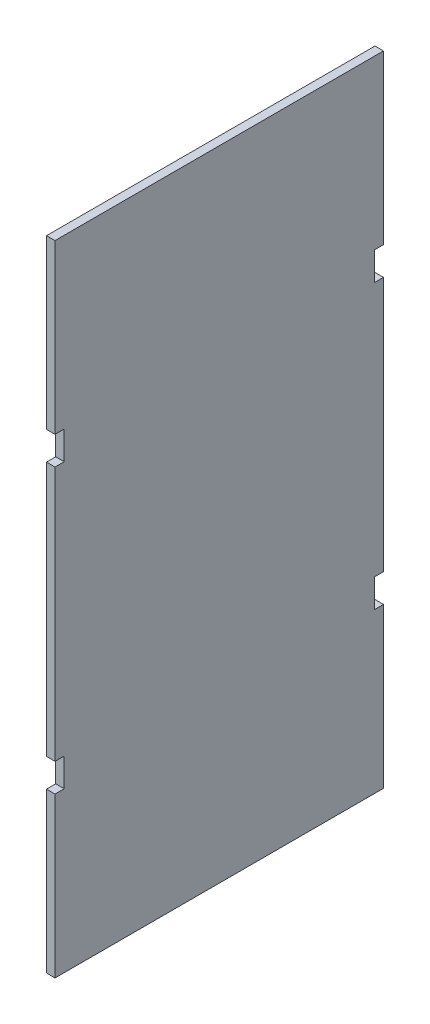
ISO-10303-21;
HEADER;
FILE_DESCRIPTION(('STEP AP214'),'2;1');
FILE_NAME('part.step','',(''),(''),'','','');
FILE_SCHEMA(('AUTOMOTIVE_DESIGN { 1 0 10303 214 1 1 1 1 }'));
ENDSEC;
DATA;
#1=APPLICATION_CONTEXT('core data for automotive mechanical design processes');
#2=APPLICATION_PROTOCOL_DEFINITION('international standard','automotive_design',2000,#1);
#3=PRODUCT_CONTEXT('',#1,'mechanical');
#4=PRODUCT('Part','Part','',(#3));
#5=PRODUCT_RELATED_PRODUCT_CATEGORY('part','',(#4));
#6=PRODUCT_DEFINITION_FORMATION('','',#4);
#7=PRODUCT_DEFINITION_CONTEXT('part definition',#1,'design');
#8=PRODUCT_DEFINITION('design','',#6,#7);
#9=PRODUCT_DEFINITION_SHAPE('','',#8);
#10=(LENGTH_UNIT() NAMED_UNIT(*) SI_UNIT(.MILLI.,.METRE.));
#11=(NAMED_UNIT(*) PLANE_ANGLE_UNIT() SI_UNIT($,.RADIAN.));
#12=(NAMED_UNIT(*) SI_UNIT($,.STERADIAN.) SOLID_ANGLE_UNIT());
#13=UNCERTAINTY_MEASURE_WITH_UNIT(LENGTH_MEASURE(1.E-05),#10,'distance_accuracy_value','');
#14=(GEOMETRIC_REPRESENTATION_CONTEXT(3) GLOBAL_UNCERTAINTY_ASSIGNED_CONTEXT((#13)) GLOBAL_UNIT_ASSIGNED_CONTEXT((#10,
#11,#12)) REPRESENTATION_CONTEXT('',''));
#15=CARTESIAN_POINT('',(0.,0.,0.));
#16=DIRECTION('',(0.,0.,1.));
#17=DIRECTION('',(1.,0.,0.));
#18=AXIS2_PLACEMENT_3D('',#15,#16,#17);
#19=CARTESIAN_POINT('',(6.,112.5,2.0417695312247E-12));
#20=DIRECTION('',(0.,0.,-1.));
#21=DIRECTION('',(0.,1.,0.));
#22=AXIS2_PLACEMENT_3D('',#19,#20,#21);
#23=PLANE('',#22);
#24=DIRECTION('',(0.,-1.,0.));
#25=VECTOR('',#24,1.);
#26=CARTESIAN_POINT('',(0.,112.5,2.0417695312247E-12));
#27=LINE('',#26,#25);
#28=CARTESIAN_POINT('',(0.,112.5,2.0417695312247E-12));
#29=VERTEX_POINT('',#28);
#30=CARTESIAN_POINT('',(0.,0.,0.));
#31=VERTEX_POINT('',#30);
#32=EDGE_CURVE('E218',#29,#31,#27,.T.);
#33=ORIENTED_EDGE('',*,*,#32,.T.);
#34=DIRECTION('',(-1.,0.,0.));
#35=VECTOR('',#34,1.);
#36=CARTESIAN_POINT('',(6.,0.,0.));
#37=LINE('',#36,#35);
#38=CARTESIAN_POINT('',(6.,0.,0.));
#39=VERTEX_POINT('',#38);
#40=EDGE_CURVE('E11',#39,#31,#37,.T.);
#41=ORIENTED_EDGE('',*,*,#40,.F.);
#42=DIRECTION('',(0.,-1.,0.));
#43=VECTOR('',#42,1.);
#44=CARTESIAN_POINT('',(6.,112.5,2.0417695312247E-12));
#45=LINE('',#44,#43);
#46=CARTESIAN_POINT('',(6.,112.5,2.0417695312247E-12));
#47=VERTEX_POINT('',#46);
#48=EDGE_CURVE('E276',#47,#39,#45,.T.);
#49=ORIENTED_EDGE('',*,*,#48,.F.);
#50=DIRECTION('',(-1.,0.,0.));
#51=VECTOR('',#50,1.);
#52=CARTESIAN_POINT('',(6.,112.5,2.0417695312247E-12));
#53=LINE('',#52,#51);
#54=EDGE_CURVE('E214',#47,#29,#53,.T.);
#55=ORIENTED_EDGE('',*,*,#54,.T.);
#56=EDGE_LOOP('',(#33,#41,#49,#55));
#57=FACE_BOUND('',#56,.T.);
#58=ADVANCED_FACE('F45',(#57),#23,.F.);
#59=CARTESIAN_POINT('',(6.,0.,0.));
#60=DIRECTION('',(0.,1.,0.));
#61=DIRECTION('',(0.,0.,1.));
#62=AXIS2_PLACEMENT_3D('',#59,#60,#61);
#63=PLANE('',#62);
#64=DIRECTION('',(0.,0.,-1.));
#65=VECTOR('',#64,1.);
#66=CARTESIAN_POINT('',(0.,0.,0.));
#67=LINE('',#66,#65);
#68=CARTESIAN_POINT('',(0.,0.,-232.));
#69=VERTEX_POINT('',#68);
#70=EDGE_CURVE('E222',#31,#69,#67,.T.);
#71=ORIENTED_EDGE('',*,*,#70,.T.);
#72=DIRECTION('',(-1.,0.,0.));
#73=VECTOR('',#72,1.);
#74=CARTESIAN_POINT('',(6.,0.,-232.));
#75=LINE('',#74,#73);
#76=CARTESIAN_POINT('',(6.,0.,-232.));
#77=VERTEX_POINT('',#76);
#78=EDGE_CURVE('E54',#77,#69,#75,.T.);
#79=ORIENTED_EDGE('',*,*,#78,.F.);
#80=DIRECTION('',(0.,0.,-1.));
#81=VECTOR('',#80,1.);
#82=CARTESIAN_POINT('',(6.,0.,0.));
#83=LINE('',#82,#81);
#84=EDGE_CURVE('E141',#39,#77,#83,.T.);
#85=ORIENTED_EDGE('',*,*,#84,.F.);
#86=ORIENTED_EDGE('',*,*,#40,.T.);
#87=EDGE_LOOP('',(#71,#79,#85,#86));
#88=FACE_BOUND('',#87,.T.);
#89=ADVANCED_FACE('F426',(#88),#63,.F.);
#90=CARTESIAN_POINT('',(6.,0.,-232.));
#91=DIRECTION('',(0.,0.,1.));
#92=DIRECTION('',(1.,0.,0.));
#93=AXIS2_PLACEMENT_3D('',#90,#91,#92);
#94=PLANE('',#93);
#95=DIRECTION('',(0.,1.,0.));
#96=VECTOR('',#95,1.);
#97=CARTESIAN_POINT('',(0.,0.,-232.));
#98=LINE('',#97,#96);
#99=CARTESIAN_POINT('',(0.,112.5,-232.));
#100=VERTEX_POINT('',#99);
#101=EDGE_CURVE('E225',#69,#100,#98,.T.);
#102=ORIENTED_EDGE('',*,*,#101,.T.);
#103=DIRECTION('',(-1.,0.,0.));
#104=VECTOR('',#103,1.);
#105=CARTESIAN_POINT('',(6.,112.5,-232.));
#106=LINE('',#105,#104);
#107=CARTESIAN_POINT('',(6.,112.5,-232.));
#108=VERTEX_POINT('',#107);
#109=EDGE_CURVE('E335',#108,#100,#106,.T.);
#110=ORIENTED_EDGE('',*,*,#109,.F.);
#111=DIRECTION('',(0.,1.,0.));
#112=VECTOR('',#111,1.);
#113=CARTESIAN_POINT('',(6.,0.,-232.));
#114=LINE('',#113,#112);
#115=EDGE_CURVE('E345',#77,#108,#114,.T.);
#116=ORIENTED_EDGE('',*,*,#115,.F.);
#117=ORIENTED_EDGE('',*,*,#78,.T.);
#118=EDGE_LOOP('',(#102,#110,#116,#117));
#119=FACE_BOUND('',#118,.T.);
#120=ADVANCED_FACE('F343',(#119),#94,.F.);
#121=CARTESIAN_POINT('',(6.,112.5,-225.5));
#122=DIRECTION('',(0.,-1.,0.));
#123=DIRECTION('',(0.,0.,-1.));
#124=AXIS2_PLACEMENT_3D('',#121,#122,#123);
#125=PLANE('',#124);
#126=DIRECTION('',(0.,0.,1.));
#127=VECTOR('',#126,1.);
#128=CARTESIAN_POINT('',(0.,112.5,-225.5));
#129=LINE('',#128,#127);
#130=CARTESIAN_POINT('',(0.,112.5,-225.5));
#131=VERTEX_POINT('',#130);
#132=EDGE_CURVE('E228',#100,#131,#129,.T.);
#133=ORIENTED_EDGE('',*,*,#132,.T.);
#134=DIRECTION('',(-1.,0.,0.));
#135=VECTOR('',#134,1.);
#136=CARTESIAN_POINT('',(6.,112.5,-225.5));
#137=LINE('',#136,#135);
#138=CARTESIAN_POINT('',(6.,112.5,-225.5));
#139=VERTEX_POINT('',#138);
#140=EDGE_CURVE('E331',#139,#131,#137,.T.);
#141=ORIENTED_EDGE('',*,*,#140,.F.);
#142=DIRECTION('',(0.,0.,1.));
#143=VECTOR('',#142,1.);
#144=CARTESIAN_POINT('',(6.,112.5,-225.5));
#145=LINE('',#144,#143);
#146=EDGE_CURVE('E364',#108,#139,#145,.T.);
#147=ORIENTED_EDGE('',*,*,#146,.F.);
#148=ORIENTED_EDGE('',*,*,#109,.T.);
#149=EDGE_LOOP('',(#133,#141,#147,#148));
#150=FACE_BOUND('',#149,.T.);
#151=ADVANCED_FACE('F354',(#150),#125,.F.);
#152=CARTESIAN_POINT('',(6.,132.5,-225.5));
#153=DIRECTION('',(0.,0.,1.));
#154=DIRECTION('',(1.,0.,0.));
#155=AXIS2_PLACEMENT_3D('',#152,#153,#154);
#156=PLANE('',#155);
#157=DIRECTION('',(0.,1.,0.));
#158=VECTOR('',#157,1.);
#159=CARTESIAN_POINT('',(0.,132.5,-225.5));
#160=LINE('',#159,#158);
#161=CARTESIAN_POINT('',(0.,132.5,-225.5));
#162=VERTEX_POINT('',#161);
#163=EDGE_CURVE('E231',#131,#162,#160,.T.);
#164=ORIENTED_EDGE('',*,*,#163,.T.);
#165=DIRECTION('',(-1.,0.,0.));
#166=VECTOR('',#165,1.);
#167=CARTESIAN_POINT('',(6.,132.5,-225.5));
#168=LINE('',#167,#166);
#169=CARTESIAN_POINT('',(6.,132.5,-225.5));
#170=VERTEX_POINT('',#169);
#171=EDGE_CURVE('E327',#170,#162,#168,.T.);
#172=ORIENTED_EDGE('',*,*,#171,.F.);
#173=DIRECTION('',(0.,1.,0.));
#174=VECTOR('',#173,1.);
#175=CARTESIAN_POINT('',(6.,132.5,-225.5));
#176=LINE('',#175,#174);
#177=EDGE_CURVE('E360',#139,#170,#176,.T.);
#178=ORIENTED_EDGE('',*,*,#177,.F.);
#179=ORIENTED_EDGE('',*,*,#140,.T.);
#180=EDGE_LOOP('',(#164,#172,#178,#179));
#181=FACE_BOUND('',#180,.T.);
#182=ADVANCED_FACE('F358',(#181),#156,.F.);
#183=CARTESIAN_POINT('',(6.,132.5,-232.));
#184=DIRECTION('',(0.,1.,0.));
#185=DIRECTION('',(0.,0.,1.));
#186=AXIS2_PLACEMENT_3D('',#183,#184,#185);
#187=PLANE('',#186);
#188=DIRECTION('',(0.,0.,-1.));
#189=VECTOR('',#188,1.);
#190=CARTESIAN_POINT('',(0.,132.5,-232.));
#191=LINE('',#190,#189);
#192=CARTESIAN_POINT('',(0.,132.5,-232.));
#193=VERTEX_POINT('',#192);
#194=EDGE_CURVE('E234',#162,#193,#191,.T.);
#195=ORIENTED_EDGE('',*,*,#194,.T.);
#196=DIRECTION('',(-1.,0.,0.));
#197=VECTOR('',#196,1.);
#198=CARTESIAN_POINT('',(6.,132.5,-232.));
#199=LINE('',#198,#197);
#200=CARTESIAN_POINT('',(6.,132.5,-232.));
#201=VERTEX_POINT('',#200);
#202=EDGE_CURVE('E323',#201,#193,#199,.T.);
#203=ORIENTED_EDGE('',*,*,#202,.F.);
#204=DIRECTION('',(0.,0.,-1.));
#205=VECTOR('',#204,1.);
#206=CARTESIAN_POINT('',(6.,132.5,-232.));
#207=LINE('',#206,#205);
#208=EDGE_CURVE('E363',#170,#201,#207,.T.);
#209=ORIENTED_EDGE('',*,*,#208,.F.);
#210=ORIENTED_EDGE('',*,*,#171,.T.);
#211=EDGE_LOOP('',(#195,#203,#209,#210));
#212=FACE_BOUND('',#211,.T.);
#213=ADVANCED_FACE('F439',(#212),#187,.F.);
#214=CARTESIAN_POINT('',(6.,132.5,-232.));
#215=DIRECTION('',(0.,0.,1.));
#216=DIRECTION('',(1.,0.,0.));
#217=AXIS2_PLACEMENT_3D('',#214,#215,#216);
#218=PLANE('',#217);
#219=DIRECTION('',(0.,1.,0.));
#220=VECTOR('',#219,1.);
#221=CARTESIAN_POINT('',(0.,132.5,-232.));
#222=LINE('',#221,#220);
#223=CARTESIAN_POINT('',(0.,312.5,-232.));
#224=VERTEX_POINT('',#223);
#225=EDGE_CURVE('E237',#193,#224,#222,.T.);
#226=ORIENTED_EDGE('',*,*,#225,.T.);
#227=DIRECTION('',(-1.,0.,0.));
#228=VECTOR('',#227,1.);
#229=CARTESIAN_POINT('',(6.,312.5,-232.));
#230=LINE('',#229,#228);
#231=CARTESIAN_POINT('',(6.,312.5,-232.));
#232=VERTEX_POINT('',#231);
#233=EDGE_CURVE('E319',#232,#224,#230,.T.);
#234=ORIENTED_EDGE('',*,*,#233,.F.);
#235=DIRECTION('',(0.,1.,0.));
#236=VECTOR('',#235,1.);
#237=CARTESIAN_POINT('',(6.,132.5,-232.));
#238=LINE('',#237,#236);
#239=EDGE_CURVE('E368',#201,#232,#238,.T.);
#240=ORIENTED_EDGE('',*,*,#239,.F.);
#241=ORIENTED_EDGE('',*,*,#202,.T.);
#242=EDGE_LOOP('',(#226,#234,#240,#241));
#243=FACE_BOUND('',#242,.T.);
#244=ADVANCED_FACE('F442',(#243),#218,.F.);
#245=CARTESIAN_POINT('',(6.,312.5,-225.5));
#246=DIRECTION('',(0.,-1.,0.));
#247=DIRECTION('',(0.,0.,-1.));
#248=AXIS2_PLACEMENT_3D('',#245,#246,#247);
#249=PLANE('',#248);
#250=DIRECTION('',(0.,0.,1.));
#251=VECTOR('',#250,1.);
#252=CARTESIAN_POINT('',(0.,312.5,-225.5));
#253=LINE('',#252,#251);
#254=CARTESIAN_POINT('',(0.,312.5,-225.5));
#255=VERTEX_POINT('',#254);
#256=EDGE_CURVE('E240',#224,#255,#253,.T.);
#257=ORIENTED_EDGE('',*,*,#256,.T.);
#258=DIRECTION('',(-1.,0.,0.));
#259=VECTOR('',#258,1.);
#260=CARTESIAN_POINT('',(6.,312.5,-225.5));
#261=LINE('',#260,#259);
#262=CARTESIAN_POINT('',(6.,312.5,-225.5));
#263=VERTEX_POINT('',#262);
#264=EDGE_CURVE('E315',#263,#255,#261,.T.);
#265=ORIENTED_EDGE('',*,*,#264,.F.);
#266=DIRECTION('',(0.,0.,1.));
#267=VECTOR('',#266,1.);
#268=CARTESIAN_POINT('',(6.,312.5,-225.5));
#269=LINE('',#268,#267);
#270=EDGE_CURVE('E375',#232,#263,#269,.T.);
#271=ORIENTED_EDGE('',*,*,#270,.F.);
#272=ORIENTED_EDGE('',*,*,#233,.T.);
#273=EDGE_LOOP('',(#257,#265,#271,#272));
#274=FACE_BOUND('',#273,.T.);
#275=ADVANCED_FACE('F446',(#274),#249,.F.);
#276=CARTESIAN_POINT('',(6.,332.5,-225.5));
#277=DIRECTION('',(0.,0.,1.));
#278=DIRECTION('',(1.,0.,0.));
#279=AXIS2_PLACEMENT_3D('',#276,#277,#278);
#280=PLANE('',#279);
#281=DIRECTION('',(0.,1.,0.));
#282=VECTOR('',#281,1.);
#283=CARTESIAN_POINT('',(0.,332.5,-225.5));
#284=LINE('',#283,#282);
#285=CARTESIAN_POINT('',(0.,332.5,-225.5));
#286=VERTEX_POINT('',#285);
#287=EDGE_CURVE('E243',#255,#286,#284,.T.);
#288=ORIENTED_EDGE('',*,*,#287,.T.);
#289=DIRECTION('',(-1.,0.,0.));
#290=VECTOR('',#289,1.);
#291=CARTESIAN_POINT('',(6.,332.5,-225.5));
#292=LINE('',#291,#290);
#293=CARTESIAN_POINT('',(6.,332.5,-225.5));
#294=VERTEX_POINT('',#293);
#295=EDGE_CURVE('E311',#294,#286,#292,.T.);
#296=ORIENTED_EDGE('',*,*,#295,.F.);
#297=DIRECTION('',(0.,1.,0.));
#298=VECTOR('',#297,1.);
#299=CARTESIAN_POINT('',(6.,332.5,-225.5));
#300=LINE('',#299,#298);
#301=EDGE_CURVE('E378',#263,#294,#300,.T.);
#302=ORIENTED_EDGE('',*,*,#301,.F.);
#303=ORIENTED_EDGE('',*,*,#264,.T.);
#304=EDGE_LOOP('',(#288,#296,#302,#303));
#305=FACE_BOUND('',#304,.T.);
#306=ADVANCED_FACE('F450',(#305),#280,.F.);
#307=CARTESIAN_POINT('',(6.,332.5,-232.));
#308=DIRECTION('',(0.,1.,0.));
#309=DIRECTION('',(0.,0.,1.));
#310=AXIS2_PLACEMENT_3D('',#307,#308,#309);
#311=PLANE('',#310);
#312=DIRECTION('',(0.,0.,-1.));
#313=VECTOR('',#312,1.);
#314=CARTESIAN_POINT('',(0.,332.5,-232.));
#315=LINE('',#314,#313);
#316=CARTESIAN_POINT('',(0.,332.5,-232.));
#317=VERTEX_POINT('',#316);
#318=EDGE_CURVE('E246',#286,#317,#315,.T.);
#319=ORIENTED_EDGE('',*,*,#318,.T.);
#320=DIRECTION('',(-1.,0.,0.));
#321=VECTOR('',#320,1.);
#322=CARTESIAN_POINT('',(6.,332.5,-232.));
#323=LINE('',#322,#321);
#324=CARTESIAN_POINT('',(6.,332.5,-232.));
#325=VERTEX_POINT('',#324);
#326=EDGE_CURVE('E307',#325,#317,#323,.T.);
#327=ORIENTED_EDGE('',*,*,#326,.F.);
#328=DIRECTION('',(0.,0.,-1.));
#329=VECTOR('',#328,1.);
#330=CARTESIAN_POINT('',(6.,332.5,-232.));
#331=LINE('',#330,#329);
#332=EDGE_CURVE('E381',#294,#325,#331,.T.);
#333=ORIENTED_EDGE('',*,*,#332,.F.);
#334=ORIENTED_EDGE('',*,*,#295,.T.);
#335=EDGE_LOOP('',(#319,#327,#333,#334));
#336=FACE_BOUND('',#335,.T.);
#337=ADVANCED_FACE('F454',(#336),#311,.F.);
#338=CARTESIAN_POINT('',(6.,332.5,-232.));
#339=DIRECTION('',(0.,0.,1.));
#340=DIRECTION('',(1.,0.,0.));
#341=AXIS2_PLACEMENT_3D('',#338,#339,#340);
#342=PLANE('',#341);
#343=DIRECTION('',(0.,1.,0.));
#344=VECTOR('',#343,1.);
#345=CARTESIAN_POINT('',(0.,332.5,-232.));
#346=LINE('',#345,#344);
#347=CARTESIAN_POINT('',(0.,451.,-232.));
#348=VERTEX_POINT('',#347);
#349=EDGE_CURVE('E249',#317,#348,#346,.T.);
#350=ORIENTED_EDGE('',*,*,#349,.T.);
#351=DIRECTION('',(-1.,0.,0.));
#352=VECTOR('',#351,1.);
#353=CARTESIAN_POINT('',(6.,451.,-232.));
#354=LINE('',#353,#352);
#355=CARTESIAN_POINT('',(6.,451.,-232.));
#356=VERTEX_POINT('',#355);
#357=EDGE_CURVE('E303',#356,#348,#354,.T.);
#358=ORIENTED_EDGE('',*,*,#357,.F.);
#359=DIRECTION('',(0.,1.,0.));
#360=VECTOR('',#359,1.);
#361=CARTESIAN_POINT('',(6.,332.5,-232.));
#362=LINE('',#361,#360);
#363=EDGE_CURVE('E384',#325,#356,#362,.T.);
#364=ORIENTED_EDGE('',*,*,#363,.F.);
#365=ORIENTED_EDGE('',*,*,#326,.T.);
#366=EDGE_LOOP('',(#350,#358,#364,#365));
#367=FACE_BOUND('',#366,.T.);
#368=ADVANCED_FACE('F458',(#367),#342,.F.);
#369=CARTESIAN_POINT('',(6.,451.,-232.));
#370=DIRECTION('',(0.,-1.,0.));
#371=DIRECTION('',(0.,0.,-1.));
#372=AXIS2_PLACEMENT_3D('',#369,#370,#371);
#373=PLANE('',#372);
#374=DIRECTION('',(0.,0.,1.));
#375=VECTOR('',#374,1.);
#376=CARTESIAN_POINT('',(0.,451.,-232.));
#377=LINE('',#376,#375);
#378=CARTESIAN_POINT('',(0.,451.,0.));
#379=VERTEX_POINT('',#378);
#380=EDGE_CURVE('E252',#348,#379,#377,.T.);
#381=ORIENTED_EDGE('',*,*,#380,.T.);
#382=DIRECTION('',(-1.,0.,0.));
#383=VECTOR('',#382,1.);
#384=CARTESIAN_POINT('',(6.,451.,0.));
#385=LINE('',#384,#383);
#386=CARTESIAN_POINT('',(6.,451.,0.));
#387=VERTEX_POINT('',#386);
#388=EDGE_CURVE('E299',#387,#379,#385,.T.);
#389=ORIENTED_EDGE('',*,*,#388,.F.);
#390=DIRECTION('',(0.,0.,1.));
#391=VECTOR('',#390,1.);
#392=CARTESIAN_POINT('',(6.,451.,-232.));
#393=LINE('',#392,#391);
#394=EDGE_CURVE('E387',#356,#387,#393,.T.);
#395=ORIENTED_EDGE('',*,*,#394,.F.);
#396=ORIENTED_EDGE('',*,*,#357,.T.);
#397=EDGE_LOOP('',(#381,#389,#395,#396));
#398=FACE_BOUND('',#397,.T.);
#399=ADVANCED_FACE('F462',(#398),#373,.F.);
#400=CARTESIAN_POINT('',(6.,451.,0.));
#401=DIRECTION('',(0.,0.,-1.));
#402=DIRECTION('',(0.,1.,0.));
#403=AXIS2_PLACEMENT_3D('',#400,#401,#402);
#404=PLANE('',#403);
#405=DIRECTION('',(0.,-1.,0.));
#406=VECTOR('',#405,1.);
#407=CARTESIAN_POINT('',(0.,451.,0.));
#408=LINE('',#407,#406);
#409=CARTESIAN_POINT('',(0.,332.5,2.06779038336435E-12));
#410=VERTEX_POINT('',#409);
#411=EDGE_CURVE('E255',#379,#410,#408,.T.);
#412=ORIENTED_EDGE('',*,*,#411,.T.);
#413=DIRECTION('',(-1.,0.,0.));
#414=VECTOR('',#413,1.);
#415=CARTESIAN_POINT('',(6.,332.5,2.06779038336435E-12));
#416=LINE('',#415,#414);
#417=CARTESIAN_POINT('',(6.,332.5,2.06779038336435E-12));
#418=VERTEX_POINT('',#417);
#419=EDGE_CURVE('E295',#418,#410,#416,.T.);
#420=ORIENTED_EDGE('',*,*,#419,.F.);
#421=DIRECTION('',(0.,-1.,0.));
#422=VECTOR('',#421,1.);
#423=CARTESIAN_POINT('',(6.,451.,0.));
#424=LINE('',#423,#422);
#425=EDGE_CURVE('E390',#387,#418,#424,.T.);
#426=ORIENTED_EDGE('',*,*,#425,.F.);
#427=ORIENTED_EDGE('',*,*,#388,.T.);
#428=EDGE_LOOP('',(#412,#420,#426,#427));
#429=FACE_BOUND('',#428,.T.);
#430=ADVANCED_FACE('F466',(#429),#404,.F.);
#431=CARTESIAN_POINT('',(6.,332.5,-6.49999999999793));
#432=DIRECTION('',(0.,1.,0.));
#433=DIRECTION('',(0.,0.,1.));
#434=AXIS2_PLACEMENT_3D('',#431,#432,#433);
#435=PLANE('',#434);
#436=DIRECTION('',(0.,0.,-1.));
#437=VECTOR('',#436,1.);
#438=CARTESIAN_POINT('',(0.,332.5,-6.49999999999793));
#439=LINE('',#438,#437);
#440=CARTESIAN_POINT('',(0.,332.5,-6.49999999999793));
#441=VERTEX_POINT('',#440);
#442=EDGE_CURVE('E258',#410,#441,#439,.T.);
#443=ORIENTED_EDGE('',*,*,#442,.T.);
#444=DIRECTION('',(-1.,0.,0.));
#445=VECTOR('',#444,1.);
#446=CARTESIAN_POINT('',(6.,332.5,-6.49999999999793));
#447=LINE('',#446,#445);
#448=CARTESIAN_POINT('',(6.,332.5,-6.49999999999793));
#449=VERTEX_POINT('',#448);
#450=EDGE_CURVE('E291',#449,#441,#447,.T.);
#451=ORIENTED_EDGE('',*,*,#450,.F.);
#452=DIRECTION('',(0.,0.,-1.));
#453=VECTOR('',#452,1.);
#454=CARTESIAN_POINT('',(6.,332.5,-6.49999999999793));
#455=LINE('',#454,#453);
#456=EDGE_CURVE('E393',#418,#449,#455,.T.);
#457=ORIENTED_EDGE('',*,*,#456,.F.);
#458=ORIENTED_EDGE('',*,*,#419,.T.);
#459=EDGE_LOOP('',(#443,#451,#457,#458));
#460=FACE_BOUND('',#459,.T.);
#461=ADVANCED_FACE('F470',(#460),#435,.F.);
#462=CARTESIAN_POINT('',(6.,312.5,-6.49999999999793));
#463=DIRECTION('',(0.,0.,-1.));
#464=DIRECTION('',(-1.,0.,0.));
#465=AXIS2_PLACEMENT_3D('',#462,#463,#464);
#466=PLANE('',#465);
#467=DIRECTION('',(0.,-1.,0.));
#468=VECTOR('',#467,1.);
#469=CARTESIAN_POINT('',(0.,312.5,-6.49999999999793));
#470=LINE('',#469,#468);
#471=CARTESIAN_POINT('',(0.,312.5,-6.49999999999793));
#472=VERTEX_POINT('',#471);
#473=EDGE_CURVE('E261',#441,#472,#470,.T.);
#474=ORIENTED_EDGE('',*,*,#473,.T.);
#475=DIRECTION('',(-1.,0.,0.));
#476=VECTOR('',#475,1.);
#477=CARTESIAN_POINT('',(6.,312.5,-6.49999999999793));
#478=LINE('',#477,#476);
#479=CARTESIAN_POINT('',(6.,312.5,-6.49999999999793));
#480=VERTEX_POINT('',#479);
#481=EDGE_CURVE('E287',#480,#472,#478,.T.);
#482=ORIENTED_EDGE('',*,*,#481,.F.);
#483=DIRECTION('',(0.,-1.,0.));
#484=VECTOR('',#483,1.);
#485=CARTESIAN_POINT('',(6.,312.5,-6.49999999999793));
#486=LINE('',#485,#484);
#487=EDGE_CURVE('E396',#449,#480,#486,.T.);
#488=ORIENTED_EDGE('',*,*,#487,.F.);
#489=ORIENTED_EDGE('',*,*,#450,.T.);
#490=EDGE_LOOP('',(#474,#482,#488,#489));
#491=FACE_BOUND('',#490,.T.);
#492=ADVANCED_FACE('F474',(#491),#466,.F.);
#493=CARTESIAN_POINT('',(6.,312.5,2.07125983031631E-12));
#494=DIRECTION('',(0.,-1.,0.));
#495=DIRECTION('',(0.,0.,-1.));
#496=AXIS2_PLACEMENT_3D('',#493,#494,#495);
#497=PLANE('',#496);
#498=DIRECTION('',(0.,0.,1.));
#499=VECTOR('',#498,1.);
#500=CARTESIAN_POINT('',(0.,312.5,2.07125983031631E-12));
#501=LINE('',#500,#499);
#502=CARTESIAN_POINT('',(0.,312.5,2.07125983031631E-12));
#503=VERTEX_POINT('',#502);
#504=EDGE_CURVE('E264',#472,#503,#501,.T.);
#505=ORIENTED_EDGE('',*,*,#504,.T.);
#506=DIRECTION('',(-1.,0.,0.));
#507=VECTOR('',#506,1.);
#508=CARTESIAN_POINT('',(6.,312.5,2.07125983031631E-12));
#509=LINE('',#508,#507);
#510=CARTESIAN_POINT('',(6.,312.5,2.07125983031631E-12));
#511=VERTEX_POINT('',#510);
#512=EDGE_CURVE('E283',#511,#503,#509,.T.);
#513=ORIENTED_EDGE('',*,*,#512,.F.);
#514=DIRECTION('',(0.,0.,1.));
#515=VECTOR('',#514,1.);
#516=CARTESIAN_POINT('',(6.,312.5,2.07125983031631E-12));
#517=LINE('',#516,#515);
#518=EDGE_CURVE('E399',#480,#511,#517,.T.);
#519=ORIENTED_EDGE('',*,*,#518,.F.);
#520=ORIENTED_EDGE('',*,*,#481,.T.);
#521=EDGE_LOOP('',(#505,#513,#519,#520));
#522=FACE_BOUND('',#521,.T.);
#523=ADVANCED_FACE('F407',(#522),#497,.F.);
#524=CARTESIAN_POINT('',(6.,312.5,2.07125983031631E-12));
#525=DIRECTION('',(0.,0.,-1.));
#526=DIRECTION('',(0.,1.,0.));
#527=AXIS2_PLACEMENT_3D('',#524,#525,#526);
#528=PLANE('',#527);
#529=DIRECTION('',(0.,-1.,0.));
#530=VECTOR('',#529,1.);
#531=CARTESIAN_POINT('',(0.,312.5,2.07125983031631E-12));
#532=LINE('',#531,#530);
#533=CARTESIAN_POINT('',(0.,132.5,2.04350425470068E-12));
#534=VERTEX_POINT('',#533);
#535=EDGE_CURVE('E267',#503,#534,#532,.T.);
#536=ORIENTED_EDGE('',*,*,#535,.T.);
#537=DIRECTION('',(-1.,0.,0.));
#538=VECTOR('',#537,1.);
#539=CARTESIAN_POINT('',(6.,132.5,2.04350425470068E-12));
#540=LINE('',#539,#538);
#541=CARTESIAN_POINT('',(6.,132.5,2.04350425470068E-12));
#542=VERTEX_POINT('',#541);
#543=EDGE_CURVE('E207',#542,#534,#540,.T.);
#544=ORIENTED_EDGE('',*,*,#543,.F.);
#545=DIRECTION('',(0.,-1.,0.));
#546=VECTOR('',#545,1.);
#547=CARTESIAN_POINT('',(6.,312.5,2.07125983031631E-12));
#548=LINE('',#547,#546);
#549=EDGE_CURVE('E196',#511,#542,#548,.T.);
#550=ORIENTED_EDGE('',*,*,#549,.F.);
#551=ORIENTED_EDGE('',*,*,#512,.T.);
#552=EDGE_LOOP('',(#536,#544,#550,#551));
#553=FACE_BOUND('',#552,.T.);
#554=ADVANCED_FACE('F411',(#553),#528,.F.);
#555=CARTESIAN_POINT('',(6.,132.5,-6.49999999999795));
#556=DIRECTION('',(0.,1.,0.));
#557=DIRECTION('',(0.,0.,1.));
#558=AXIS2_PLACEMENT_3D('',#555,#556,#557);
#559=PLANE('',#558);
#560=DIRECTION('',(0.,0.,-1.));
#561=VECTOR('',#560,1.);
#562=CARTESIAN_POINT('',(0.,132.5,-6.49999999999795));
#563=LINE('',#562,#561);
#564=CARTESIAN_POINT('',(0.,132.5,-6.49999999999795));
#565=VERTEX_POINT('',#564);
#566=EDGE_CURVE('E205',#534,#565,#563,.T.);
#567=ORIENTED_EDGE('',*,*,#566,.T.);
#568=DIRECTION('',(-1.,0.,0.));
#569=VECTOR('',#568,1.);
#570=CARTESIAN_POINT('',(6.,132.5,-6.49999999999795));
#571=LINE('',#570,#569);
#572=CARTESIAN_POINT('',(6.,132.5,-6.49999999999795));
#573=VERTEX_POINT('',#572);
#574=EDGE_CURVE('E202',#573,#565,#571,.T.);
#575=ORIENTED_EDGE('',*,*,#574,.F.);
#576=DIRECTION('',(0.,0.,-1.));
#577=VECTOR('',#576,1.);
#578=CARTESIAN_POINT('',(6.,132.5,-6.49999999999795));
#579=LINE('',#578,#577);
#580=EDGE_CURVE('E190',#542,#573,#579,.T.);
#581=ORIENTED_EDGE('',*,*,#580,.F.);
#582=ORIENTED_EDGE('',*,*,#543,.T.);
#583=EDGE_LOOP('',(#567,#575,#581,#582));
#584=FACE_BOUND('',#583,.T.);
#585=ADVANCED_FACE('F203',(#584),#559,.F.);
#586=CARTESIAN_POINT('',(6.,112.5,-6.49999999999795));
#587=DIRECTION('',(0.,0.,-1.));
#588=DIRECTION('',(-1.,0.,0.));
#589=AXIS2_PLACEMENT_3D('',#586,#587,#588);
#590=PLANE('',#589);
#591=DIRECTION('',(0.,-1.,0.));
#592=VECTOR('',#591,1.);
#593=CARTESIAN_POINT('',(0.,112.5,-6.49999999999795));
#594=LINE('',#593,#592);
#595=CARTESIAN_POINT('',(0.,112.5,-6.49999999999795));
#596=VERTEX_POINT('',#595);
#597=EDGE_CURVE('E127',#565,#596,#594,.T.);
#598=ORIENTED_EDGE('',*,*,#597,.T.);
#599=DIRECTION('',(-1.,0.,0.));
#600=VECTOR('',#599,1.);
#601=CARTESIAN_POINT('',(6.,112.5,-6.49999999999795));
#602=LINE('',#601,#600);
#603=CARTESIAN_POINT('',(6.,112.5,-6.49999999999795));
#604=VERTEX_POINT('',#603);
#605=EDGE_CURVE('E208',#604,#596,#602,.T.);
#606=ORIENTED_EDGE('',*,*,#605,.F.);
#607=DIRECTION('',(0.,-1.,0.));
#608=VECTOR('',#607,1.);
#609=CARTESIAN_POINT('',(6.,112.5,-6.49999999999795));
#610=LINE('',#609,#608);
#611=EDGE_CURVE('E194',#573,#604,#610,.T.);
#612=ORIENTED_EDGE('',*,*,#611,.F.);
#613=ORIENTED_EDGE('',*,*,#574,.T.);
#614=EDGE_LOOP('',(#598,#606,#612,#613));
#615=FACE_BOUND('',#614,.T.);
#616=ADVANCED_FACE('F210',(#615),#590,.F.);
#617=CARTESIAN_POINT('',(6.,112.5,2.0417695312247E-12));
#618=DIRECTION('',(0.,-1.,0.));
#619=DIRECTION('',(0.,0.,-1.));
#620=AXIS2_PLACEMENT_3D('',#617,#618,#619);
#621=PLANE('',#620);
#622=DIRECTION('',(0.,0.,1.));
#623=VECTOR('',#622,1.);
#624=CARTESIAN_POINT('',(0.,112.5,2.0417695312247E-12));
#625=LINE('',#624,#623);
#626=EDGE_CURVE('E133',#596,#29,#625,.T.);
#627=ORIENTED_EDGE('',*,*,#626,.T.);
#628=ORIENTED_EDGE('',*,*,#54,.F.);
#629=DIRECTION('',(0.,0.,1.));
#630=VECTOR('',#629,1.);
#631=CARTESIAN_POINT('',(6.,112.5,2.0417695312247E-12));
#632=LINE('',#631,#630);
#633=EDGE_CURVE('E62',#604,#47,#632,.T.);
#634=ORIENTED_EDGE('',*,*,#633,.F.);
#635=ORIENTED_EDGE('',*,*,#605,.T.);
#636=EDGE_LOOP('',(#627,#628,#634,#635));
#637=FACE_BOUND('',#636,.T.);
#638=ADVANCED_FACE('F415',(#637),#621,.F.);
#639=CARTESIAN_POINT('',(6.,0.,0.));
#640=DIRECTION('',(1.,0.,0.));
#641=DIRECTION('',(0.,0.,-1.));
#642=AXIS2_PLACEMENT_3D('',#639,#640,#641);
#643=PLANE('',#642);
#644=ORIENTED_EDGE('',*,*,#48,.T.);
#645=ORIENTED_EDGE('',*,*,#84,.T.);
#646=ORIENTED_EDGE('',*,*,#115,.T.);
#647=ORIENTED_EDGE('',*,*,#146,.T.);
#648=ORIENTED_EDGE('',*,*,#177,.T.);
#649=ORIENTED_EDGE('',*,*,#208,.T.);
#650=ORIENTED_EDGE('',*,*,#239,.T.);
#651=ORIENTED_EDGE('',*,*,#270,.T.);
#652=ORIENTED_EDGE('',*,*,#301,.T.);
#653=ORIENTED_EDGE('',*,*,#332,.T.);
#654=ORIENTED_EDGE('',*,*,#363,.T.);
#655=ORIENTED_EDGE('',*,*,#394,.T.);
#656=ORIENTED_EDGE('',*,*,#425,.T.);
#657=ORIENTED_EDGE('',*,*,#456,.T.);
#658=ORIENTED_EDGE('',*,*,#487,.T.);
#659=ORIENTED_EDGE('',*,*,#518,.T.);
#660=ORIENTED_EDGE('',*,*,#549,.T.);
#661=ORIENTED_EDGE('',*,*,#580,.T.);
#662=ORIENTED_EDGE('',*,*,#611,.T.);
#663=ORIENTED_EDGE('',*,*,#633,.T.);
#664=EDGE_LOOP('',(#644,#645,#646,#647,#648,#649,#650,#651,#652,#653,#654,#655,#656,#657,#658,
#659,#660,#661,#662,#663));
#665=FACE_BOUND('',#664,.T.);
#666=ADVANCED_FACE('F192',(#665),#643,.T.);
#667=CARTESIAN_POINT('',(0.,0.,0.));
#668=DIRECTION('',(1.,0.,0.));
#669=DIRECTION('',(0.,0.,-1.));
#670=AXIS2_PLACEMENT_3D('',#667,#668,#669);
#671=PLANE('',#670);
#672=ORIENTED_EDGE('',*,*,#32,.F.);
#673=ORIENTED_EDGE('',*,*,#626,.F.);
#674=ORIENTED_EDGE('',*,*,#597,.F.);
#675=ORIENTED_EDGE('',*,*,#566,.F.);
#676=ORIENTED_EDGE('',*,*,#535,.F.);
#677=ORIENTED_EDGE('',*,*,#504,.F.);
#678=ORIENTED_EDGE('',*,*,#473,.F.);
#679=ORIENTED_EDGE('',*,*,#442,.F.);
#680=ORIENTED_EDGE('',*,*,#411,.F.);
#681=ORIENTED_EDGE('',*,*,#380,.F.);
#682=ORIENTED_EDGE('',*,*,#349,.F.);
#683=ORIENTED_EDGE('',*,*,#318,.F.);
#684=ORIENTED_EDGE('',*,*,#287,.F.);
#685=ORIENTED_EDGE('',*,*,#256,.F.);
#686=ORIENTED_EDGE('',*,*,#225,.F.);
#687=ORIENTED_EDGE('',*,*,#194,.F.);
#688=ORIENTED_EDGE('',*,*,#163,.F.);
#689=ORIENTED_EDGE('',*,*,#132,.F.);
#690=ORIENTED_EDGE('',*,*,#101,.F.);
#691=ORIENTED_EDGE('',*,*,#70,.F.);
#692=EDGE_LOOP('',(#672,#673,#674,#675,#676,#677,#678,#679,#680,#681,#682,#683,#684,#685,#686,
#687,#688,#689,#690,#691));
#693=FACE_BOUND('',#692,.T.);
#694=ADVANCED_FACE('F349',(#693),#671,.F.);
#695=CLOSED_SHELL('',(#58,#89,#120,#151,#182,#213,#244,#275,#306,#337,#368,#399,#430,#461,#492,
#523,#554,#585,#616,#638,#666,#694));
#696=MANIFOLD_SOLID_BREP('B2',#695);
#697=ADVANCED_BREP_SHAPE_REPRESENTATION('',(#18,#696),#14);
#698=SHAPE_DEFINITION_REPRESENTATION(#9,#697);
ENDSEC;
END-ISO-10303-21;
